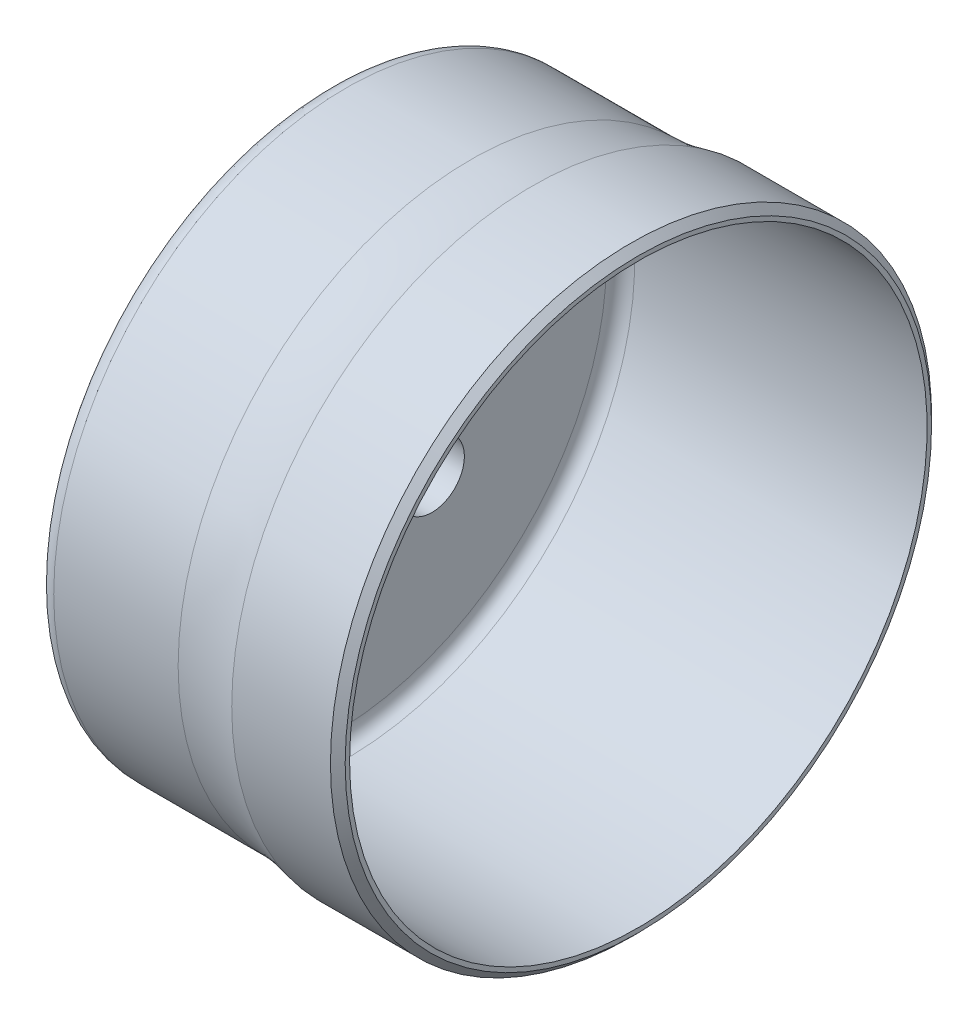
ISO-10303-21;
HEADER;
FILE_DESCRIPTION(('STEP AP214'),'2;1');
FILE_NAME('part.step','',(''),(''),'','','');
FILE_SCHEMA(('AUTOMOTIVE_DESIGN { 1 0 10303 214 1 1 1 1 }'));
ENDSEC;
DATA;
#1=APPLICATION_CONTEXT('core data for automotive mechanical design processes');
#2=APPLICATION_PROTOCOL_DEFINITION('international standard','automotive_design',2000,#1);
#3=PRODUCT_CONTEXT('',#1,'mechanical');
#4=PRODUCT('Part','Part','',(#3));
#5=PRODUCT_RELATED_PRODUCT_CATEGORY('part','',(#4));
#6=PRODUCT_DEFINITION_FORMATION('','',#4);
#7=PRODUCT_DEFINITION_CONTEXT('part definition',#1,'design');
#8=PRODUCT_DEFINITION('design','',#6,#7);
#9=PRODUCT_DEFINITION_SHAPE('','',#8);
#10=(LENGTH_UNIT() NAMED_UNIT(*) SI_UNIT(.MILLI.,.METRE.));
#11=(NAMED_UNIT(*) PLANE_ANGLE_UNIT() SI_UNIT($,.RADIAN.));
#12=(NAMED_UNIT(*) SI_UNIT($,.STERADIAN.) SOLID_ANGLE_UNIT());
#13=UNCERTAINTY_MEASURE_WITH_UNIT(LENGTH_MEASURE(1.E-05),#10,'distance_accuracy_value','');
#14=(GEOMETRIC_REPRESENTATION_CONTEXT(3) GLOBAL_UNCERTAINTY_ASSIGNED_CONTEXT((#13)) GLOBAL_UNIT_ASSIGNED_CONTEXT((#10,
#11,#12)) REPRESENTATION_CONTEXT('',''));
#15=CARTESIAN_POINT('',(0.,0.,0.));
#16=DIRECTION('',(0.,0.,1.));
#17=DIRECTION('',(1.,0.,0.));
#18=AXIS2_PLACEMENT_3D('',#15,#16,#17);
#19=CARTESIAN_POINT('',(2.69999999999956,16.,0.));
#20=DIRECTION('',(1.,0.,0.));
#21=DIRECTION('',(0.,0.,-1.));
#22=AXIS2_PLACEMENT_3D('',#19,#20,#21);
#23=PLANE('',#22);
#24=CARTESIAN_POINT('',(2.69999999999956,0.,0.));
#25=DIRECTION('',(-1.,0.,0.));
#26=DIRECTION('',(0.,0.,1.));
#27=AXIS2_PLACEMENT_3D('',#24,#25,#26);
#28=CIRCLE('',#27,16.);
#29=CARTESIAN_POINT('',(2.69999999999956,0.,16.));
#30=VERTEX_POINT('',#29);
#31=EDGE_CURVE('E51',#30,#30,#28,.T.);
#32=ORIENTED_EDGE('',*,*,#31,.F.);
#33=EDGE_LOOP('',(#32));
#34=FACE_BOUND('',#33,.T.);
#35=CARTESIAN_POINT('',(2.69999999999956,0.,0.));
#36=DIRECTION('',(1.,0.,0.));
#37=DIRECTION('',(0.,0.,-1.));
#38=AXIS2_PLACEMENT_3D('',#35,#36,#37);
#39=CIRCLE('',#38,23.3);
#40=CARTESIAN_POINT('',(2.69999999999956,0.,-23.3));
#41=VERTEX_POINT('',#40);
#42=CARTESIAN_POINT('',(2.69999999999956,0.,23.3));
#43=VERTEX_POINT('',#42);
#44=EDGE_CURVE('E46',#41,#43,#39,.T.);
#45=ORIENTED_EDGE('',*,*,#44,.F.);
#46=CARTESIAN_POINT('',(2.69999999999956,0.,0.));
#47=DIRECTION('',(1.,0.,0.));
#48=DIRECTION('',(0.,0.,1.));
#49=AXIS2_PLACEMENT_3D('',#46,#47,#48);
#50=CIRCLE('',#49,23.3);
#51=EDGE_CURVE('E44',#43,#41,#50,.T.);
#52=ORIENTED_EDGE('',*,*,#51,.F.);
#53=EDGE_LOOP('',(#45,#52));
#54=FACE_BOUND('',#53,.T.);
#55=ADVANCED_FACE('F16',(#34,#54),#23,.F.);
#56=CARTESIAN_POINT('',(4.19999999999956,0.,0.));
#57=DIRECTION('',(1.,0.,0.));
#58=DIRECTION('',(0.,0.,-1.));
#59=AXIS2_PLACEMENT_3D('',#56,#57,#58);
#60=TOROIDAL_SURFACE('',#59,23.3,1.5);
#61=CARTESIAN_POINT('',(4.19999999999956,0.,0.));
#62=DIRECTION('',(-1.,0.,0.));
#63=DIRECTION('',(0.,0.,1.));
#64=AXIS2_PLACEMENT_3D('',#61,#62,#63);
#65=CIRCLE('',#64,24.8);
#66=CARTESIAN_POINT('',(4.19999999999956,0.,24.8));
#67=VERTEX_POINT('',#66);
#68=EDGE_CURVE('E73',#67,#67,#65,.F.);
#69=ORIENTED_EDGE('',*,*,#68,.F.);
#70=EDGE_LOOP('',(#69));
#71=FACE_BOUND('',#70,.T.);
#72=ORIENTED_EDGE('',*,*,#44,.T.);
#73=ORIENTED_EDGE('',*,*,#51,.T.);
#74=EDGE_LOOP('',(#72,#73));
#75=FACE_BOUND('',#74,.T.);
#76=ADVANCED_FACE('F48',(#71,#75),#60,.T.);
#77=CARTESIAN_POINT('',(0.,0.,0.));
#78=DIRECTION('',(-1.,0.,0.));
#79=DIRECTION('',(0.,0.,1.));
#80=AXIS2_PLACEMENT_3D('',#77,#78,#79);
#81=CYLINDRICAL_SURFACE('',#80,16.);
#82=CARTESIAN_POINT('',(0.,0.,0.));
#83=DIRECTION('',(-1.,0.,0.));
#84=DIRECTION('',(0.,0.,1.));
#85=AXIS2_PLACEMENT_3D('',#82,#83,#84);
#86=CIRCLE('',#85,16.);
#87=CARTESIAN_POINT('',(0.,0.,16.));
#88=VERTEX_POINT('',#87);
#89=EDGE_CURVE('E164',#88,#88,#86,.F.);
#90=ORIENTED_EDGE('',*,*,#89,.T.);
#91=EDGE_LOOP('',(#90));
#92=FACE_BOUND('',#91,.T.);
#93=ORIENTED_EDGE('',*,*,#31,.T.);
#94=EDGE_LOOP('',(#93));
#95=FACE_BOUND('',#94,.T.);
#96=ADVANCED_FACE('F78',(#92,#95),#81,.T.);
#97=CARTESIAN_POINT('',(0.,0.,0.));
#98=DIRECTION('',(-1.,0.,0.));
#99=DIRECTION('',(0.,0.,1.));
#100=AXIS2_PLACEMENT_3D('',#97,#98,#99);
#101=CONICAL_SURFACE('',#100,8.49999999999993,0.785398163397442);
#102=CARTESIAN_POINT('',(0.,0.,0.));
#103=DIRECTION('',(-1.,0.,0.));
#104=DIRECTION('',(0.,0.,1.));
#105=AXIS2_PLACEMENT_3D('',#102,#103,#104);
#106=CIRCLE('',#105,8.49999999999993);
#107=CARTESIAN_POINT('',(0.,0.,8.49999999999993));
#108=VERTEX_POINT('',#107);
#109=EDGE_CURVE('E160',#108,#108,#106,.T.);
#110=ORIENTED_EDGE('',*,*,#109,.T.);
#111=EDGE_LOOP('',(#110));
#112=FACE_BOUND('',#111,.T.);
#113=CARTESIAN_POINT('',(0.500000000000014,0.,0.));
#114=DIRECTION('',(-1.,0.,0.));
#115=DIRECTION('',(0.,0.,1.));
#116=AXIS2_PLACEMENT_3D('',#113,#114,#115);
#117=CIRCLE('',#116,7.99999999999992);
#118=CARTESIAN_POINT('',(0.500000000000014,0.,7.99999999999992));
#119=VERTEX_POINT('',#118);
#120=EDGE_CURVE('E163',#119,#119,#117,.F.);
#121=ORIENTED_EDGE('',*,*,#120,.T.);
#122=EDGE_LOOP('',(#121));
#123=FACE_BOUND('',#122,.T.);
#124=ADVANCED_FACE('F253',(#112,#123),#101,.F.);
#125=CARTESIAN_POINT('',(0.,0.,0.));
#126=DIRECTION('',(-1.,0.,0.));
#127=DIRECTION('',(0.,0.,1.));
#128=AXIS2_PLACEMENT_3D('',#125,#126,#127);
#129=CYLINDRICAL_SURFACE('',#128,24.8);
#130=ORIENTED_EDGE('',*,*,#68,.T.);
#131=EDGE_LOOP('',(#130));
#132=FACE_BOUND('',#131,.T.);
#133=CARTESIAN_POINT('',(14.7550023832227,0.,0.));
#134=DIRECTION('',(-1.,0.,0.));
#135=DIRECTION('',(0.,0.,1.));
#136=AXIS2_PLACEMENT_3D('',#133,#134,#135);
#137=CIRCLE('',#136,24.8);
#138=CARTESIAN_POINT('',(14.7550023832227,0.,24.8));
#139=VERTEX_POINT('',#138);
#140=EDGE_CURVE('E159',#139,#139,#137,.T.);
#141=ORIENTED_EDGE('',*,*,#140,.T.);
#142=EDGE_LOOP('',(#141));
#143=FACE_BOUND('',#142,.T.);
#144=ADVANCED_FACE('F250',(#132,#143),#129,.T.);
#145=CARTESIAN_POINT('',(0.,7.99999999999992,0.));
#146=DIRECTION('',(1.,0.,0.));
#147=DIRECTION('',(0.,0.,-1.));
#148=AXIS2_PLACEMENT_3D('',#145,#146,#147);
#149=PLANE('',#148);
#150=CARTESIAN_POINT('',(0.,12.4723736889024,-5.16622633692872));
#151=DIRECTION('',(-1.,0.,0.));
#152=DIRECTION('',(0.,0.,1.));
#153=AXIS2_PLACEMENT_3D('',#150,#151,#152);
#154=CIRCLE('',#153,1.24999999999999);
#155=CARTESIAN_POINT('',(0.,12.4723736889024,-3.91622633692873));
#156=VERTEX_POINT('',#155);
#157=EDGE_CURVE('E156',#156,#156,#154,.F.);
#158=ORIENTED_EDGE('',*,*,#157,.T.);
#159=EDGE_LOOP('',(#158));
#160=FACE_BOUND('',#159,.T.);
#161=CARTESIAN_POINT('',(0.,8.48528137423867,8.48528137423847));
#162=DIRECTION('',(-1.,0.,0.));
#163=DIRECTION('',(0.,0.,1.));
#164=AXIS2_PLACEMENT_3D('',#161,#162,#163);
#165=CIRCLE('',#164,2.74999999999999);
#166=CARTESIAN_POINT('',(0.,8.48528137423867,11.2352813742385));
#167=VERTEX_POINT('',#166);
#168=EDGE_CURVE('E150',#167,#167,#165,.F.);
#169=ORIENTED_EDGE('',*,*,#168,.T.);
#170=EDGE_LOOP('',(#169));
#171=FACE_BOUND('',#170,.T.);
#172=CARTESIAN_POINT('',(0.,-8.4852813742385,8.48528137423864));
#173=DIRECTION('',(-1.,0.,0.));
#174=DIRECTION('',(0.,0.,1.));
#175=AXIS2_PLACEMENT_3D('',#172,#173,#174);
#176=CIRCLE('',#175,2.74999999999999);
#177=CARTESIAN_POINT('',(0.,-8.4852813742385,11.2352813742386));
#178=VERTEX_POINT('',#177);
#179=EDGE_CURVE('E144',#178,#178,#176,.F.);
#180=ORIENTED_EDGE('',*,*,#179,.T.);
#181=EDGE_LOOP('',(#180));
#182=FACE_BOUND('',#181,.T.);
#183=CARTESIAN_POINT('',(0.,-8.48528137423861,-8.48528137423853));
#184=DIRECTION('',(-1.,0.,0.));
#185=DIRECTION('',(0.,0.,1.));
#186=AXIS2_PLACEMENT_3D('',#183,#184,#185);
#187=CIRCLE('',#186,2.74999999999999);
#188=CARTESIAN_POINT('',(0.,-8.48528137423861,-5.73528137423853));
#189=VERTEX_POINT('',#188);
#190=EDGE_CURVE('E138',#189,#189,#187,.F.);
#191=ORIENTED_EDGE('',*,*,#190,.T.);
#192=EDGE_LOOP('',(#191));
#193=FACE_BOUND('',#192,.T.);
#194=CARTESIAN_POINT('',(0.,8.48528137423856,-8.48528137423859));
#195=DIRECTION('',(-1.,0.,0.));
#196=DIRECTION('',(0.,0.,1.));
#197=AXIS2_PLACEMENT_3D('',#194,#195,#196);
#198=CIRCLE('',#197,2.74999999999999);
#199=CARTESIAN_POINT('',(0.,8.48528137423856,-5.73528137423859));
#200=VERTEX_POINT('',#199);
#201=EDGE_CURVE('E132',#200,#200,#198,.F.);
#202=ORIENTED_EDGE('',*,*,#201,.T.);
#203=EDGE_LOOP('',(#202));
#204=FACE_BOUND('',#203,.T.);
#205=CARTESIAN_POINT('',(0.,12.,0.));
#206=DIRECTION('',(-1.,0.,0.));
#207=DIRECTION('',(0.,0.,1.));
#208=AXIS2_PLACEMENT_3D('',#205,#206,#207);
#209=CIRCLE('',#208,2.74999999999999);
#210=CARTESIAN_POINT('',(0.,12.,2.74999999999999));
#211=VERTEX_POINT('',#210);
#212=EDGE_CURVE('E128',#211,#211,#209,.F.);
#213=ORIENTED_EDGE('',*,*,#212,.T.);
#214=EDGE_LOOP('',(#213));
#215=FACE_BOUND('',#214,.T.);
#216=ORIENTED_EDGE('',*,*,#109,.F.);
#217=EDGE_LOOP('',(#216));
#218=FACE_BOUND('',#217,.T.);
#219=ORIENTED_EDGE('',*,*,#89,.F.);
#220=EDGE_LOOP('',(#219));
#221=FACE_BOUND('',#220,.T.);
#222=CARTESIAN_POINT('',(0.,0.,-12.));
#223=DIRECTION('',(-1.,0.,0.));
#224=DIRECTION('',(0.,0.,1.));
#225=AXIS2_PLACEMENT_3D('',#222,#223,#224);
#226=CIRCLE('',#225,2.74999999999999);
#227=CARTESIAN_POINT('',(0.,0.,-9.25000000000001));
#228=VERTEX_POINT('',#227);
#229=EDGE_CURVE('E135',#228,#228,#226,.F.);
#230=ORIENTED_EDGE('',*,*,#229,.T.);
#231=EDGE_LOOP('',(#230));
#232=FACE_BOUND('',#231,.T.);
#233=CARTESIAN_POINT('',(0.,-12.,0.));
#234=DIRECTION('',(-1.,0.,0.));
#235=DIRECTION('',(0.,0.,1.));
#236=AXIS2_PLACEMENT_3D('',#233,#234,#235);
#237=CIRCLE('',#236,2.74999999999999);
#238=CARTESIAN_POINT('',(0.,-12.,2.74999999999999));
#239=VERTEX_POINT('',#238);
#240=EDGE_CURVE('E141',#239,#239,#237,.F.);
#241=ORIENTED_EDGE('',*,*,#240,.T.);
#242=EDGE_LOOP('',(#241));
#243=FACE_BOUND('',#242,.T.);
#244=CARTESIAN_POINT('',(0.,1.25693328198353E-13,12.));
#245=DIRECTION('',(-1.,0.,0.));
#246=DIRECTION('',(0.,0.,1.));
#247=AXIS2_PLACEMENT_3D('',#244,#245,#246);
#248=CIRCLE('',#247,2.74999999999999);
#249=CARTESIAN_POINT('',(0.,1.25693328198353E-13,14.75));
#250=VERTEX_POINT('',#249);
#251=EDGE_CURVE('E147',#250,#250,#248,.F.);
#252=ORIENTED_EDGE('',*,*,#251,.T.);
#253=EDGE_LOOP('',(#252));
#254=FACE_BOUND('',#253,.T.);
#255=CARTESIAN_POINT('',(0.,-12.4723736889024,5.16622633692872));
#256=DIRECTION('',(-1.,0.,0.));
#257=DIRECTION('',(0.,0.,1.));
#258=AXIS2_PLACEMENT_3D('',#255,#256,#257);
#259=CIRCLE('',#258,1.24999999999999);
#260=CARTESIAN_POINT('',(0.,-12.4723736889024,6.41622633692871));
#261=VERTEX_POINT('',#260);
#262=EDGE_CURVE('E153',#261,#261,#259,.F.);
#263=ORIENTED_EDGE('',*,*,#262,.T.);
#264=EDGE_LOOP('',(#263));
#265=FACE_BOUND('',#264,.T.);
#266=ADVANCED_FACE('F246',(#160,#171,#182,#193,#204,#215,#218,#221,#232,#243,#254,#265),#149,.F.);
#267=CARTESIAN_POINT('',(0.,0.,0.));
#268=DIRECTION('',(-1.,0.,0.));
#269=DIRECTION('',(0.,0.,1.));
#270=AXIS2_PLACEMENT_3D('',#267,#268,#269);
#271=CYLINDRICAL_SURFACE('',#270,7.99999999999992);
#272=ORIENTED_EDGE('',*,*,#120,.F.);
#273=EDGE_LOOP('',(#272));
#274=FACE_BOUND('',#273,.T.);
#275=CARTESIAN_POINT('',(2.49999999999957,0.,0.));
#276=DIRECTION('',(1.,0.,0.));
#277=DIRECTION('',(0.,0.,-1.));
#278=AXIS2_PLACEMENT_3D('',#275,#276,#277);
#279=CIRCLE('',#278,7.99999999999992);
#280=CARTESIAN_POINT('',(2.49999999999957,0.,-7.99999999999992));
#281=VERTEX_POINT('',#280);
#282=EDGE_CURVE('E131',#281,#281,#279,.T.);
#283=ORIENTED_EDGE('',*,*,#282,.T.);
#284=EDGE_LOOP('',(#283));
#285=FACE_BOUND('',#284,.T.);
#286=ADVANCED_FACE('F241',(#274,#285),#271,.F.);
#287=CARTESIAN_POINT('',(14.7550023832227,0.,0.));
#288=DIRECTION('',(-1.,0.,0.));
#289=DIRECTION('',(0.,0.,1.));
#290=AXIS2_PLACEMENT_3D('',#287,#288,#289);
#291=TOROIDAL_SURFACE('',#290,44.8,20.);
#292=ORIENTED_EDGE('',*,*,#140,.F.);
#293=EDGE_LOOP('',(#292));
#294=FACE_BOUND('',#293,.T.);
#295=CARTESIAN_POINT('',(20.,0.,0.));
#296=DIRECTION('',(-1.,0.,0.));
#297=DIRECTION('',(0.,0.,1.));
#298=AXIS2_PLACEMENT_3D('',#295,#296,#297);
#299=CIRCLE('',#298,25.5);
#300=CARTESIAN_POINT('',(20.,0.,25.5));
#301=VERTEX_POINT('',#300);
#302=EDGE_CURVE('E127',#301,#301,#299,.F.);
#303=ORIENTED_EDGE('',*,*,#302,.F.);
#304=EDGE_LOOP('',(#303));
#305=FACE_BOUND('',#304,.T.);
#306=ADVANCED_FACE('F236',(#294,#305),#291,.F.);
#307=CARTESIAN_POINT('',(0.,12.4723736889024,-5.16622633692872));
#308=DIRECTION('',(-1.,0.,0.));
#309=DIRECTION('',(0.,0.,1.));
#310=AXIS2_PLACEMENT_3D('',#307,#308,#309);
#311=CYLINDRICAL_SURFACE('',#310,1.24999999999999);
#312=CARTESIAN_POINT('',(2.99999999999956,12.4723736889024,-5.16622633692872));
#313=DIRECTION('',(-1.,0.,0.));
#314=DIRECTION('',(0.,0.,1.));
#315=AXIS2_PLACEMENT_3D('',#312,#313,#314);
#316=CIRCLE('',#315,1.24999999999999);
#317=CARTESIAN_POINT('',(2.99999999999956,12.4723736889024,-3.91622633692873));
#318=VERTEX_POINT('',#317);
#319=EDGE_CURVE('E124',#318,#318,#316,.F.);
#320=ORIENTED_EDGE('',*,*,#319,.T.);
#321=EDGE_LOOP('',(#320));
#322=FACE_BOUND('',#321,.T.);
#323=ORIENTED_EDGE('',*,*,#157,.F.);
#324=EDGE_LOOP('',(#323));
#325=FACE_BOUND('',#324,.T.);
#326=ADVANCED_FACE('F240',(#322,#325),#311,.F.);
#327=CARTESIAN_POINT('',(0.,-12.4723736889024,5.16622633692872));
#328=DIRECTION('',(-1.,0.,0.));
#329=DIRECTION('',(0.,0.,1.));
#330=AXIS2_PLACEMENT_3D('',#327,#328,#329);
#331=CYLINDRICAL_SURFACE('',#330,1.24999999999999);
#332=CARTESIAN_POINT('',(2.99999999999956,-12.4723736889024,5.16622633692872));
#333=DIRECTION('',(-1.,0.,0.));
#334=DIRECTION('',(0.,0.,1.));
#335=AXIS2_PLACEMENT_3D('',#332,#333,#334);
#336=CIRCLE('',#335,1.24999999999999);
#337=CARTESIAN_POINT('',(2.99999999999956,-12.4723736889024,6.41622633692871));
#338=VERTEX_POINT('',#337);
#339=EDGE_CURVE('E121',#338,#338,#336,.F.);
#340=ORIENTED_EDGE('',*,*,#339,.T.);
#341=EDGE_LOOP('',(#340));
#342=FACE_BOUND('',#341,.T.);
#343=ORIENTED_EDGE('',*,*,#262,.F.);
#344=EDGE_LOOP('',(#343));
#345=FACE_BOUND('',#344,.T.);
#346=ADVANCED_FACE('F326',(#342,#345),#331,.F.);
#347=CARTESIAN_POINT('',(0.,8.48528137423867,8.48528137423847));
#348=DIRECTION('',(-1.,0.,0.));
#349=DIRECTION('',(0.,0.,1.));
#350=AXIS2_PLACEMENT_3D('',#347,#348,#349);
#351=CYLINDRICAL_SURFACE('',#350,2.74999999999999);
#352=CARTESIAN_POINT('',(2.99999999999956,8.48528137423867,8.48528137423847));
#353=DIRECTION('',(-1.,0.,0.));
#354=DIRECTION('',(0.,0.,1.));
#355=AXIS2_PLACEMENT_3D('',#352,#353,#354);
#356=CIRCLE('',#355,2.74999999999999);
#357=CARTESIAN_POINT('',(2.99999999999956,8.48528137423867,11.2352813742385));
#358=VERTEX_POINT('',#357);
#359=EDGE_CURVE('E118',#358,#358,#356,.F.);
#360=ORIENTED_EDGE('',*,*,#359,.T.);
#361=EDGE_LOOP('',(#360));
#362=FACE_BOUND('',#361,.T.);
#363=ORIENTED_EDGE('',*,*,#168,.F.);
#364=EDGE_LOOP('',(#363));
#365=FACE_BOUND('',#364,.T.);
#366=ADVANCED_FACE('F323',(#362,#365),#351,.F.);
#367=CARTESIAN_POINT('',(0.,1.25693328198353E-13,12.));
#368=DIRECTION('',(-1.,0.,0.));
#369=DIRECTION('',(0.,0.,1.));
#370=AXIS2_PLACEMENT_3D('',#367,#368,#369);
#371=CYLINDRICAL_SURFACE('',#370,2.74999999999999);
#372=CARTESIAN_POINT('',(2.99999999999956,1.25693328198353E-13,12.));
#373=DIRECTION('',(-1.,0.,0.));
#374=DIRECTION('',(0.,0.,1.));
#375=AXIS2_PLACEMENT_3D('',#372,#373,#374);
#376=CIRCLE('',#375,2.74999999999999);
#377=CARTESIAN_POINT('',(2.99999999999956,1.25693328198353E-13,14.75));
#378=VERTEX_POINT('',#377);
#379=EDGE_CURVE('E115',#378,#378,#376,.F.);
#380=ORIENTED_EDGE('',*,*,#379,.T.);
#381=EDGE_LOOP('',(#380));
#382=FACE_BOUND('',#381,.T.);
#383=ORIENTED_EDGE('',*,*,#251,.F.);
#384=EDGE_LOOP('',(#383));
#385=FACE_BOUND('',#384,.T.);
#386=ADVANCED_FACE('F319',(#382,#385),#371,.F.);
#387=CARTESIAN_POINT('',(0.,-8.4852813742385,8.48528137423864));
#388=DIRECTION('',(-1.,0.,0.));
#389=DIRECTION('',(0.,0.,1.));
#390=AXIS2_PLACEMENT_3D('',#387,#388,#389);
#391=CYLINDRICAL_SURFACE('',#390,2.74999999999999);
#392=CARTESIAN_POINT('',(2.99999999999956,-8.4852813742385,8.48528137423864));
#393=DIRECTION('',(-1.,0.,0.));
#394=DIRECTION('',(0.,0.,1.));
#395=AXIS2_PLACEMENT_3D('',#392,#393,#394);
#396=CIRCLE('',#395,2.74999999999999);
#397=CARTESIAN_POINT('',(2.99999999999956,-8.4852813742385,11.2352813742386));
#398=VERTEX_POINT('',#397);
#399=EDGE_CURVE('E112',#398,#398,#396,.F.);
#400=ORIENTED_EDGE('',*,*,#399,.T.);
#401=EDGE_LOOP('',(#400));
#402=FACE_BOUND('',#401,.T.);
#403=ORIENTED_EDGE('',*,*,#179,.F.);
#404=EDGE_LOOP('',(#403));
#405=FACE_BOUND('',#404,.T.);
#406=ADVANCED_FACE('F315',(#402,#405),#391,.F.);
#407=CARTESIAN_POINT('',(0.,-12.,0.));
#408=DIRECTION('',(-1.,0.,0.));
#409=DIRECTION('',(0.,0.,1.));
#410=AXIS2_PLACEMENT_3D('',#407,#408,#409);
#411=CYLINDRICAL_SURFACE('',#410,2.74999999999999);
#412=CARTESIAN_POINT('',(2.99999999999956,-12.,0.));
#413=DIRECTION('',(-1.,0.,0.));
#414=DIRECTION('',(0.,0.,1.));
#415=AXIS2_PLACEMENT_3D('',#412,#413,#414);
#416=CIRCLE('',#415,2.74999999999999);
#417=CARTESIAN_POINT('',(2.99999999999956,-12.,2.74999999999999));
#418=VERTEX_POINT('',#417);
#419=EDGE_CURVE('E109',#418,#418,#416,.F.);
#420=ORIENTED_EDGE('',*,*,#419,.T.);
#421=EDGE_LOOP('',(#420));
#422=FACE_BOUND('',#421,.T.);
#423=ORIENTED_EDGE('',*,*,#240,.F.);
#424=EDGE_LOOP('',(#423));
#425=FACE_BOUND('',#424,.T.);
#426=ADVANCED_FACE('F311',(#422,#425),#411,.F.);
#427=CARTESIAN_POINT('',(0.,-8.48528137423861,-8.48528137423853));
#428=DIRECTION('',(-1.,0.,0.));
#429=DIRECTION('',(0.,0.,1.));
#430=AXIS2_PLACEMENT_3D('',#427,#428,#429);
#431=CYLINDRICAL_SURFACE('',#430,2.74999999999999);
#432=CARTESIAN_POINT('',(2.99999999999956,-8.48528137423861,-8.48528137423853));
#433=DIRECTION('',(-1.,0.,0.));
#434=DIRECTION('',(0.,0.,1.));
#435=AXIS2_PLACEMENT_3D('',#432,#433,#434);
#436=CIRCLE('',#435,2.74999999999999);
#437=CARTESIAN_POINT('',(2.99999999999956,-8.48528137423861,-5.73528137423853));
#438=VERTEX_POINT('',#437);
#439=EDGE_CURVE('E106',#438,#438,#436,.F.);
#440=ORIENTED_EDGE('',*,*,#439,.T.);
#441=EDGE_LOOP('',(#440));
#442=FACE_BOUND('',#441,.T.);
#443=ORIENTED_EDGE('',*,*,#190,.F.);
#444=EDGE_LOOP('',(#443));
#445=FACE_BOUND('',#444,.T.);
#446=ADVANCED_FACE('F307',(#442,#445),#431,.F.);
#447=CARTESIAN_POINT('',(0.,0.,-12.));
#448=DIRECTION('',(-1.,0.,0.));
#449=DIRECTION('',(0.,0.,1.));
#450=AXIS2_PLACEMENT_3D('',#447,#448,#449);
#451=CYLINDRICAL_SURFACE('',#450,2.74999999999999);
#452=CARTESIAN_POINT('',(2.99999999999956,0.,-12.));
#453=DIRECTION('',(-1.,0.,0.));
#454=DIRECTION('',(0.,0.,1.));
#455=AXIS2_PLACEMENT_3D('',#452,#453,#454);
#456=CIRCLE('',#455,2.74999999999999);
#457=CARTESIAN_POINT('',(2.99999999999956,0.,-9.25000000000001));
#458=VERTEX_POINT('',#457);
#459=EDGE_CURVE('E103',#458,#458,#456,.F.);
#460=ORIENTED_EDGE('',*,*,#459,.T.);
#461=EDGE_LOOP('',(#460));
#462=FACE_BOUND('',#461,.T.);
#463=ORIENTED_EDGE('',*,*,#229,.F.);
#464=EDGE_LOOP('',(#463));
#465=FACE_BOUND('',#464,.T.);
#466=ADVANCED_FACE('F303',(#462,#465),#451,.F.);
#467=CARTESIAN_POINT('',(0.,8.48528137423856,-8.48528137423859));
#468=DIRECTION('',(-1.,0.,0.));
#469=DIRECTION('',(0.,0.,1.));
#470=AXIS2_PLACEMENT_3D('',#467,#468,#469);
#471=CYLINDRICAL_SURFACE('',#470,2.74999999999999);
#472=CARTESIAN_POINT('',(2.99999999999956,8.48528137423856,-8.48528137423859));
#473=DIRECTION('',(-1.,0.,0.));
#474=DIRECTION('',(0.,0.,1.));
#475=AXIS2_PLACEMENT_3D('',#472,#473,#474);
#476=CIRCLE('',#475,2.74999999999999);
#477=CARTESIAN_POINT('',(2.99999999999956,8.48528137423856,-5.73528137423859));
#478=VERTEX_POINT('',#477);
#479=EDGE_CURVE('E100',#478,#478,#476,.F.);
#480=ORIENTED_EDGE('',*,*,#479,.T.);
#481=EDGE_LOOP('',(#480));
#482=FACE_BOUND('',#481,.T.);
#483=ORIENTED_EDGE('',*,*,#201,.F.);
#484=EDGE_LOOP('',(#483));
#485=FACE_BOUND('',#484,.T.);
#486=ADVANCED_FACE('F296',(#482,#485),#471,.F.);
#487=CARTESIAN_POINT('',(0.,12.,0.));
#488=DIRECTION('',(-1.,0.,0.));
#489=DIRECTION('',(0.,0.,1.));
#490=AXIS2_PLACEMENT_3D('',#487,#488,#489);
#491=CYLINDRICAL_SURFACE('',#490,2.74999999999999);
#492=CARTESIAN_POINT('',(2.99999999999956,12.,0.));
#493=DIRECTION('',(-1.,0.,0.));
#494=DIRECTION('',(0.,0.,1.));
#495=AXIS2_PLACEMENT_3D('',#492,#493,#494);
#496=CIRCLE('',#495,2.74999999999999);
#497=CARTESIAN_POINT('',(2.99999999999956,12.,2.74999999999999));
#498=VERTEX_POINT('',#497);
#499=EDGE_CURVE('E97',#498,#498,#496,.F.);
#500=ORIENTED_EDGE('',*,*,#499,.T.);
#501=EDGE_LOOP('',(#500));
#502=FACE_BOUND('',#501,.T.);
#503=ORIENTED_EDGE('',*,*,#212,.F.);
#504=EDGE_LOOP('',(#503));
#505=FACE_BOUND('',#504,.T.);
#506=ADVANCED_FACE('F289',(#502,#505),#491,.F.);
#507=CARTESIAN_POINT('',(2.99999999999956,0.,0.));
#508=DIRECTION('',(1.,0.,0.));
#509=DIRECTION('',(0.,1.,0.));
#510=AXIS2_PLACEMENT_3D('',#507,#508,#509);
#511=CONICAL_SURFACE('',#510,8.49999999999992,0.785398163397448);
#512=CARTESIAN_POINT('',(2.99999999999956,0.,0.));
#513=DIRECTION('',(1.,0.,0.));
#514=DIRECTION('',(0.,1.,0.));
#515=AXIS2_PLACEMENT_3D('',#512,#513,#514);
#516=CIRCLE('',#515,8.49999999999992);
#517=CARTESIAN_POINT('',(2.99999999999956,8.49999999999992,0.));
#518=VERTEX_POINT('',#517);
#519=EDGE_CURVE('E94',#518,#518,#516,.T.);
#520=ORIENTED_EDGE('',*,*,#519,.T.);
#521=EDGE_LOOP('',(#520));
#522=FACE_BOUND('',#521,.T.);
#523=ORIENTED_EDGE('',*,*,#282,.F.);
#524=EDGE_LOOP('',(#523));
#525=FACE_BOUND('',#524,.T.);
#526=ADVANCED_FACE('F284',(#522,#525),#511,.F.);
#527=CARTESIAN_POINT('',(0.,0.,0.));
#528=DIRECTION('',(-1.,0.,0.));
#529=DIRECTION('',(0.,0.,1.));
#530=AXIS2_PLACEMENT_3D('',#527,#528,#529);
#531=CYLINDRICAL_SURFACE('',#530,25.5);
#532=ORIENTED_EDGE('',*,*,#302,.T.);
#533=EDGE_LOOP('',(#532));
#534=FACE_BOUND('',#533,.T.);
#535=CARTESIAN_POINT('',(28.3752100000005,0.,0.));
#536=DIRECTION('',(-1.,0.,0.));
#537=DIRECTION('',(0.,0.,1.));
#538=AXIS2_PLACEMENT_3D('',#535,#536,#537);
#539=CIRCLE('',#538,25.5);
#540=CARTESIAN_POINT('',(28.3752100000005,0.,25.5));
#541=VERTEX_POINT('',#540);
#542=EDGE_CURVE('E222',#541,#541,#539,.F.);
#543=ORIENTED_EDGE('',*,*,#542,.F.);
#544=EDGE_LOOP('',(#543));
#545=FACE_BOUND('',#544,.T.);
#546=ADVANCED_FACE('F207',(#534,#545),#531,.T.);
#547=CARTESIAN_POINT('',(2.99999999999956,24.5,0.));
#548=DIRECTION('',(-1.,0.,0.));
#549=DIRECTION('',(0.,0.,1.));
#550=AXIS2_PLACEMENT_3D('',#547,#548,#549);
#551=PLANE('',#550);
#552=ORIENTED_EDGE('',*,*,#519,.F.);
#553=EDGE_LOOP('',(#552));
#554=FACE_BOUND('',#553,.T.);
#555=ORIENTED_EDGE('',*,*,#499,.F.);
#556=EDGE_LOOP('',(#555));
#557=FACE_BOUND('',#556,.T.);
#558=ORIENTED_EDGE('',*,*,#479,.F.);
#559=EDGE_LOOP('',(#558));
#560=FACE_BOUND('',#559,.T.);
#561=ORIENTED_EDGE('',*,*,#459,.F.);
#562=EDGE_LOOP('',(#561));
#563=FACE_BOUND('',#562,.T.);
#564=ORIENTED_EDGE('',*,*,#439,.F.);
#565=EDGE_LOOP('',(#564));
#566=FACE_BOUND('',#565,.T.);
#567=ORIENTED_EDGE('',*,*,#419,.F.);
#568=EDGE_LOOP('',(#567));
#569=FACE_BOUND('',#568,.T.);
#570=ORIENTED_EDGE('',*,*,#399,.F.);
#571=EDGE_LOOP('',(#570));
#572=FACE_BOUND('',#571,.T.);
#573=ORIENTED_EDGE('',*,*,#379,.F.);
#574=EDGE_LOOP('',(#573));
#575=FACE_BOUND('',#574,.T.);
#576=ORIENTED_EDGE('',*,*,#359,.F.);
#577=EDGE_LOOP('',(#576));
#578=FACE_BOUND('',#577,.T.);
#579=ORIENTED_EDGE('',*,*,#339,.F.);
#580=EDGE_LOOP('',(#579));
#581=FACE_BOUND('',#580,.T.);
#582=ORIENTED_EDGE('',*,*,#319,.F.);
#583=EDGE_LOOP('',(#582));
#584=FACE_BOUND('',#583,.T.);
#585=CARTESIAN_POINT('',(2.99999999999956,0.,0.));
#586=DIRECTION('',(-1.,0.,0.));
#587=DIRECTION('',(0.,0.,1.));
#588=AXIS2_PLACEMENT_3D('',#585,#586,#587);
#589=CIRCLE('',#588,23.3);
#590=CARTESIAN_POINT('',(2.99999999999956,0.,-23.3));
#591=VERTEX_POINT('',#590);
#592=CARTESIAN_POINT('',(2.99999999999956,0.,23.3));
#593=VERTEX_POINT('',#592);
#594=EDGE_CURVE('E35',#591,#593,#589,.F.);
#595=ORIENTED_EDGE('',*,*,#594,.T.);
#596=CARTESIAN_POINT('',(2.99999999999956,0.,0.));
#597=DIRECTION('',(-1.,0.,0.));
#598=DIRECTION('',(0.,0.,-1.));
#599=AXIS2_PLACEMENT_3D('',#596,#597,#598);
#600=CIRCLE('',#599,23.3);
#601=EDGE_CURVE('E93',#593,#591,#600,.F.);
#602=ORIENTED_EDGE('',*,*,#601,.T.);
#603=EDGE_LOOP('',(#595,#602));
#604=FACE_BOUND('',#603,.T.);
#605=ADVANCED_FACE('F198',(#554,#557,#560,#563,#566,#569,#572,#575,#578,#581,#584,#604),#551,.F.);
#606=CARTESIAN_POINT('',(28.3752100000005,0.,0.));
#607=DIRECTION('',(-1.,0.,0.));
#608=DIRECTION('',(0.,-1.,0.));
#609=AXIS2_PLACEMENT_3D('',#606,#607,#608);
#610=CONICAL_SURFACE('',#609,25.5,0.785398163397446);
#611=ORIENTED_EDGE('',*,*,#542,.T.);
#612=EDGE_LOOP('',(#611));
#613=FACE_BOUND('',#612,.T.);
#614=CARTESIAN_POINT('',(29.,0.,0.));
#615=DIRECTION('',(-1.,0.,0.));
#616=DIRECTION('',(0.,-1.,0.));
#617=AXIS2_PLACEMENT_3D('',#614,#615,#616);
#618=CIRCLE('',#617,24.8752100000005);
#619=CARTESIAN_POINT('',(29.,-24.8752100000005,0.));
#620=VERTEX_POINT('',#619);
#621=EDGE_CURVE('E90',#620,#620,#618,.T.);
#622=ORIENTED_EDGE('',*,*,#621,.T.);
#623=EDGE_LOOP('',(#622));
#624=FACE_BOUND('',#623,.T.);
#625=ADVANCED_FACE('F184',(#613,#624),#610,.T.);
#626=CARTESIAN_POINT('',(4.19999999999956,0.,0.));
#627=DIRECTION('',(-1.,0.,0.));
#628=DIRECTION('',(0.,0.,1.));
#629=AXIS2_PLACEMENT_3D('',#626,#627,#628);
#630=TOROIDAL_SURFACE('',#629,23.3,1.2);
#631=ORIENTED_EDGE('',*,*,#601,.F.);
#632=ORIENTED_EDGE('',*,*,#594,.F.);
#633=EDGE_LOOP('',(#631,#632));
#634=FACE_BOUND('',#633,.T.);
#635=CARTESIAN_POINT('',(4.19999999999956,0.,0.));
#636=DIRECTION('',(-1.,0.,0.));
#637=DIRECTION('',(0.,0.,1.));
#638=AXIS2_PLACEMENT_3D('',#635,#636,#637);
#639=CIRCLE('',#638,24.5);
#640=CARTESIAN_POINT('',(4.19999999999956,0.,24.5));
#641=VERTEX_POINT('',#640);
#642=EDGE_CURVE('E27',#641,#641,#639,.F.);
#643=ORIENTED_EDGE('',*,*,#642,.T.);
#644=EDGE_LOOP('',(#643));
#645=FACE_BOUND('',#644,.T.);
#646=ADVANCED_FACE('F172',(#634,#645),#630,.F.);
#647=CARTESIAN_POINT('',(29.,24.8752100000005,0.));
#648=DIRECTION('',(-1.,0.,0.));
#649=DIRECTION('',(0.,0.,1.));
#650=AXIS2_PLACEMENT_3D('',#647,#648,#649);
#651=PLANE('',#650);
#652=CARTESIAN_POINT('',(29.,0.,0.));
#653=DIRECTION('',(-1.,0.,0.));
#654=DIRECTION('',(0.,0.,1.));
#655=AXIS2_PLACEMENT_3D('',#652,#653,#654);
#656=CIRCLE('',#655,24.5);
#657=CARTESIAN_POINT('',(29.,0.,24.5));
#658=VERTEX_POINT('',#657);
#659=EDGE_CURVE('E11',#658,#658,#656,.T.);
#660=ORIENTED_EDGE('',*,*,#659,.T.);
#661=EDGE_LOOP('',(#660));
#662=FACE_BOUND('',#661,.T.);
#663=ORIENTED_EDGE('',*,*,#621,.F.);
#664=EDGE_LOOP('',(#663));
#665=FACE_BOUND('',#664,.T.);
#666=ADVANCED_FACE('F183',(#662,#665),#651,.F.);
#667=CARTESIAN_POINT('',(0.,0.,0.));
#668=DIRECTION('',(-1.,0.,0.));
#669=DIRECTION('',(0.,0.,1.));
#670=AXIS2_PLACEMENT_3D('',#667,#668,#669);
#671=CYLINDRICAL_SURFACE('',#670,24.5);
#672=ORIENTED_EDGE('',*,*,#642,.F.);
#673=EDGE_LOOP('',(#672));
#674=FACE_BOUND('',#673,.T.);
#675=ORIENTED_EDGE('',*,*,#659,.F.);
#676=EDGE_LOOP('',(#675));
#677=FACE_BOUND('',#676,.T.);
#678=ADVANCED_FACE('F263',(#674,#677),#671,.F.);
#679=CLOSED_SHELL('',(#55,#76,#96,#124,#144,#266,#286,#306,#326,#346,#366,#386,#406,#426,#446,
#466,#486,#506,#526,#546,#605,#625,#646,#666,#678));
#680=MANIFOLD_SOLID_BREP('B1',#679);
#681=ADVANCED_BREP_SHAPE_REPRESENTATION('',(#18,#680),#14);
#682=SHAPE_DEFINITION_REPRESENTATION(#9,#681);
ENDSEC;
END-ISO-10303-21;
